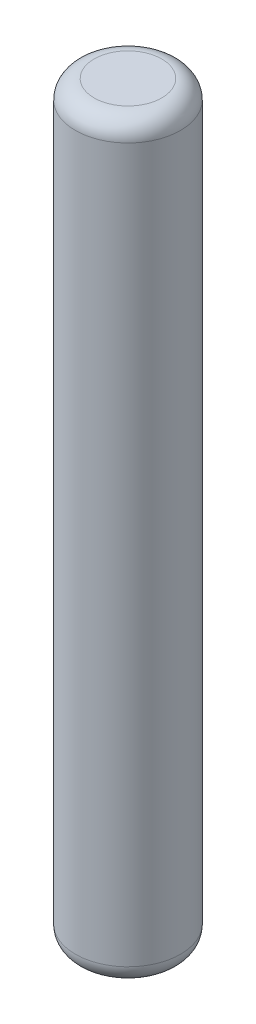
ISO-10303-21;
HEADER;
FILE_DESCRIPTION(('STEP AP214'),'2;1');
FILE_NAME('part.step','',(''),(''),'','','');
FILE_SCHEMA(('AUTOMOTIVE_DESIGN { 1 0 10303 214 1 1 1 1 }'));
ENDSEC;
DATA;
#1=APPLICATION_CONTEXT('core data for automotive mechanical design processes');
#2=APPLICATION_PROTOCOL_DEFINITION('international standard','automotive_design',2000,#1);
#3=PRODUCT_CONTEXT('',#1,'mechanical');
#4=PRODUCT('Part','Part','',(#3));
#5=PRODUCT_RELATED_PRODUCT_CATEGORY('part','',(#4));
#6=PRODUCT_DEFINITION_FORMATION('','',#4);
#7=PRODUCT_DEFINITION_CONTEXT('part definition',#1,'design');
#8=PRODUCT_DEFINITION('design','',#6,#7);
#9=PRODUCT_DEFINITION_SHAPE('','',#8);
#10=(LENGTH_UNIT() NAMED_UNIT(*) SI_UNIT(.MILLI.,.METRE.));
#11=(NAMED_UNIT(*) PLANE_ANGLE_UNIT() SI_UNIT($,.RADIAN.));
#12=(NAMED_UNIT(*) SI_UNIT($,.STERADIAN.) SOLID_ANGLE_UNIT());
#13=UNCERTAINTY_MEASURE_WITH_UNIT(LENGTH_MEASURE(1.E-05),#10,'distance_accuracy_value','');
#14=(GEOMETRIC_REPRESENTATION_CONTEXT(3) GLOBAL_UNCERTAINTY_ASSIGNED_CONTEXT((#13)) GLOBAL_UNIT_ASSIGNED_CONTEXT((#10,
#11,#12)) REPRESENTATION_CONTEXT('',''));
#15=CARTESIAN_POINT('',(0.,0.,0.));
#16=DIRECTION('',(0.,0.,1.));
#17=DIRECTION('',(1.,0.,0.));
#18=AXIS2_PLACEMENT_3D('',#15,#16,#17);
#19=CARTESIAN_POINT('',(0.,25.4,0.));
#20=DIRECTION('',(0.,-1.,0.));
#21=DIRECTION('',(0.,0.,-1.));
#22=AXIS2_PLACEMENT_3D('',#19,#20,#21);
#23=CYLINDRICAL_SURFACE('',#22,1.778);
#24=CARTESIAN_POINT('',(0.,0.635,0.));
#25=DIRECTION('',(0.,1.,0.));
#26=DIRECTION('',(0.,0.,1.));
#27=AXIS2_PLACEMENT_3D('',#24,#25,#26);
#28=CIRCLE('',#27,1.778);
#29=CARTESIAN_POINT('',(0.,0.635,1.778));
#30=VERTEX_POINT('',#29);
#31=EDGE_CURVE('E46',#30,#30,#28,.T.);
#32=ORIENTED_EDGE('',*,*,#31,.T.);
#33=EDGE_LOOP('',(#32));
#34=FACE_BOUND('',#33,.T.);
#35=CARTESIAN_POINT('',(0.,24.765,0.));
#36=DIRECTION('',(0.,1.,0.));
#37=DIRECTION('',(0.,0.,1.));
#38=AXIS2_PLACEMENT_3D('',#35,#36,#37);
#39=CIRCLE('',#38,1.778);
#40=CARTESIAN_POINT('',(0.,24.765,1.778));
#41=VERTEX_POINT('',#40);
#42=EDGE_CURVE('E50',#41,#41,#39,.F.);
#43=ORIENTED_EDGE('',*,*,#42,.T.);
#44=EDGE_LOOP('',(#43));
#45=FACE_BOUND('',#44,.T.);
#46=ADVANCED_FACE('F35',(#34,#45),#23,.T.);
#47=CARTESIAN_POINT('',(0.,25.4,0.));
#48=DIRECTION('',(0.,1.,0.));
#49=DIRECTION('',(0.,0.,1.));
#50=AXIS2_PLACEMENT_3D('',#47,#48,#49);
#51=PLANE('',#50);
#52=CARTESIAN_POINT('',(0.,25.4,0.));
#53=DIRECTION('',(0.,1.,0.));
#54=DIRECTION('',(0.,0.,1.));
#55=AXIS2_PLACEMENT_3D('',#52,#53,#54);
#56=CIRCLE('',#55,1.143);
#57=CARTESIAN_POINT('',(0.,25.4,1.143));
#58=VERTEX_POINT('',#57);
#59=EDGE_CURVE('E10',#58,#58,#56,.T.);
#60=ORIENTED_EDGE('',*,*,#59,.T.);
#61=EDGE_LOOP('',(#60));
#62=FACE_BOUND('',#61,.T.);
#63=ADVANCED_FACE('F66',(#62),#51,.T.);
#64=CARTESIAN_POINT('',(0.,0.,0.));
#65=DIRECTION('',(0.,1.,0.));
#66=DIRECTION('',(0.,0.,1.));
#67=AXIS2_PLACEMENT_3D('',#64,#65,#66);
#68=PLANE('',#67);
#69=CARTESIAN_POINT('',(0.,0.,0.));
#70=DIRECTION('',(0.,1.,0.));
#71=DIRECTION('',(0.,0.,1.));
#72=AXIS2_PLACEMENT_3D('',#69,#70,#71);
#73=CIRCLE('',#72,1.143);
#74=CARTESIAN_POINT('',(0.,0.,1.143));
#75=VERTEX_POINT('',#74);
#76=EDGE_CURVE('E42',#75,#75,#73,.F.);
#77=ORIENTED_EDGE('',*,*,#76,.T.);
#78=EDGE_LOOP('',(#77));
#79=FACE_BOUND('',#78,.T.);
#80=ADVANCED_FACE('F63',(#79),#68,.F.);
#81=CARTESIAN_POINT('',(0.,0.635,0.));
#82=DIRECTION('',(0.,1.,0.));
#83=DIRECTION('',(0.,0.,1.));
#84=AXIS2_PLACEMENT_3D('',#81,#82,#83);
#85=TOROIDAL_SURFACE('',#84,1.143,0.635);
#86=ORIENTED_EDGE('',*,*,#76,.F.);
#87=EDGE_LOOP('',(#86));
#88=FACE_BOUND('',#87,.T.);
#89=ORIENTED_EDGE('',*,*,#31,.F.);
#90=EDGE_LOOP('',(#89));
#91=FACE_BOUND('',#90,.T.);
#92=ADVANCED_FACE('F59',(#88,#91),#85,.T.);
#93=CARTESIAN_POINT('',(0.,24.765,0.));
#94=DIRECTION('',(0.,1.,0.));
#95=DIRECTION('',(0.,0.,1.));
#96=AXIS2_PLACEMENT_3D('',#93,#94,#95);
#97=TOROIDAL_SURFACE('',#96,1.143,0.635);
#98=ORIENTED_EDGE('',*,*,#42,.F.);
#99=EDGE_LOOP('',(#98));
#100=FACE_BOUND('',#99,.T.);
#101=ORIENTED_EDGE('',*,*,#59,.F.);
#102=EDGE_LOOP('',(#101));
#103=FACE_BOUND('',#102,.T.);
#104=ADVANCED_FACE('F37',(#100,#103),#97,.T.);
#105=CLOSED_SHELL('',(#46,#63,#80,#92,#104));
#106=MANIFOLD_SOLID_BREP('B2',#105);
#107=ADVANCED_BREP_SHAPE_REPRESENTATION('',(#18,#106),#14);
#108=SHAPE_DEFINITION_REPRESENTATION(#9,#107);
ENDSEC;
END-ISO-10303-21;
